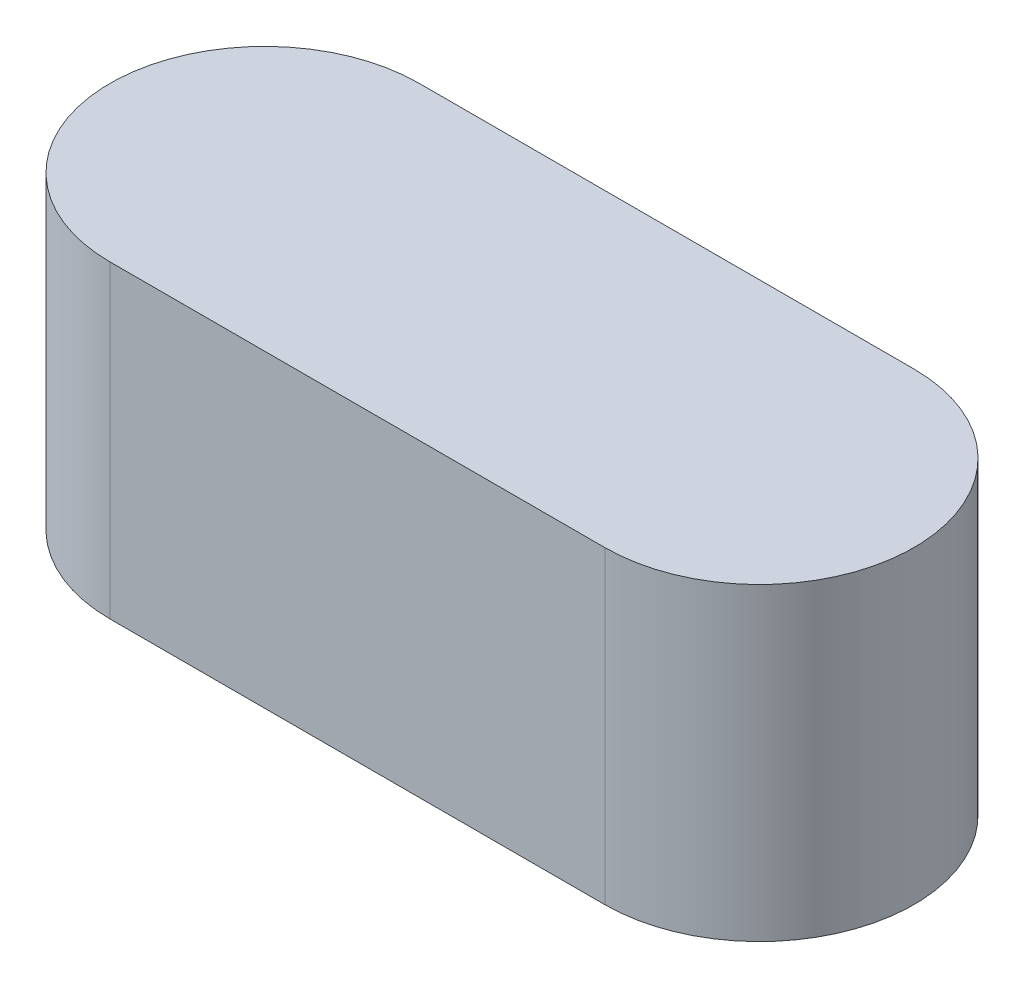
ISO-10303-21;
HEADER;
FILE_DESCRIPTION(('STEP AP214'),'2;1');
FILE_NAME('part.step','',(''),(''),'','','');
FILE_SCHEMA(('AUTOMOTIVE_DESIGN { 1 0 10303 214 1 1 1 1 }'));
ENDSEC;
DATA;
#1=APPLICATION_CONTEXT('core data for automotive mechanical design processes');
#2=APPLICATION_PROTOCOL_DEFINITION('international standard','automotive_design',2000,#1);
#3=PRODUCT_CONTEXT('',#1,'mechanical');
#4=PRODUCT('Part','Part','',(#3));
#5=PRODUCT_RELATED_PRODUCT_CATEGORY('part','',(#4));
#6=PRODUCT_DEFINITION_FORMATION('','',#4);
#7=PRODUCT_DEFINITION_CONTEXT('part definition',#1,'design');
#8=PRODUCT_DEFINITION('design','',#6,#7);
#9=PRODUCT_DEFINITION_SHAPE('','',#8);
#10=(LENGTH_UNIT() NAMED_UNIT(*) SI_UNIT(.MILLI.,.METRE.));
#11=(NAMED_UNIT(*) PLANE_ANGLE_UNIT() SI_UNIT($,.RADIAN.));
#12=(NAMED_UNIT(*) SI_UNIT($,.STERADIAN.) SOLID_ANGLE_UNIT());
#13=UNCERTAINTY_MEASURE_WITH_UNIT(LENGTH_MEASURE(1.E-05),#10,'distance_accuracy_value','');
#14=(GEOMETRIC_REPRESENTATION_CONTEXT(3) GLOBAL_UNCERTAINTY_ASSIGNED_CONTEXT((#13)) GLOBAL_UNIT_ASSIGNED_CONTEXT((#10,
#11,#12)) REPRESENTATION_CONTEXT('',''));
#15=CARTESIAN_POINT('',(0.,0.,0.));
#16=DIRECTION('',(0.,0.,1.));
#17=DIRECTION('',(1.,0.,0.));
#18=AXIS2_PLACEMENT_3D('',#15,#16,#17);
#19=CARTESIAN_POINT('',(0.,5.,0.));
#20=DIRECTION('',(0.,-1.,0.));
#21=DIRECTION('',(0.,0.,-1.));
#22=AXIS2_PLACEMENT_3D('',#19,#20,#21);
#23=CYLINDRICAL_SURFACE('',#22,2.5);
#24=CARTESIAN_POINT('',(0.,0.,0.));
#25=DIRECTION('',(0.,1.,0.));
#26=DIRECTION('',(0.,0.,1.));
#27=AXIS2_PLACEMENT_3D('',#24,#25,#26);
#28=CIRCLE('',#27,2.5);
#29=CARTESIAN_POINT('',(0.,0.,-2.5));
#30=VERTEX_POINT('',#29);
#31=CARTESIAN_POINT('',(0.,0.,2.5));
#32=VERTEX_POINT('',#31);
#33=EDGE_CURVE('E102',#30,#32,#28,.T.);
#34=ORIENTED_EDGE('',*,*,#33,.T.);
#35=DIRECTION('',(0.,-1.,0.));
#36=VECTOR('',#35,1.);
#37=CARTESIAN_POINT('',(0.,5.,2.5));
#38=LINE('',#37,#36);
#39=CARTESIAN_POINT('',(0.,5.,2.5));
#40=VERTEX_POINT('',#39);
#41=EDGE_CURVE('E11',#40,#32,#38,.T.);
#42=ORIENTED_EDGE('',*,*,#41,.F.);
#43=CARTESIAN_POINT('',(0.,5.,0.));
#44=DIRECTION('',(0.,1.,0.));
#45=DIRECTION('',(0.,0.,1.));
#46=AXIS2_PLACEMENT_3D('',#43,#44,#45);
#47=CIRCLE('',#46,2.5);
#48=CARTESIAN_POINT('',(0.,5.,-2.5));
#49=VERTEX_POINT('',#48);
#50=EDGE_CURVE('E90',#49,#40,#47,.T.);
#51=ORIENTED_EDGE('',*,*,#50,.F.);
#52=DIRECTION('',(0.,-1.,0.));
#53=VECTOR('',#52,1.);
#54=CARTESIAN_POINT('',(0.,5.,-2.5));
#55=LINE('',#54,#53);
#56=EDGE_CURVE('E98',#49,#30,#55,.T.);
#57=ORIENTED_EDGE('',*,*,#56,.T.);
#58=EDGE_LOOP('',(#34,#42,#51,#57));
#59=FACE_BOUND('',#58,.T.);
#60=ADVANCED_FACE('F39',(#59),#23,.T.);
#61=CARTESIAN_POINT('',(0.,5.,2.5));
#62=DIRECTION('',(0.,0.,-1.));
#63=DIRECTION('',(-1.,0.,0.));
#64=AXIS2_PLACEMENT_3D('',#61,#62,#63);
#65=PLANE('',#64);
#66=DIRECTION('',(1.,0.,0.));
#67=VECTOR('',#66,1.);
#68=CARTESIAN_POINT('',(0.,0.,2.5));
#69=LINE('',#68,#67);
#70=CARTESIAN_POINT('',(8.,0.,2.5));
#71=VERTEX_POINT('',#70);
#72=EDGE_CURVE('E94',#32,#71,#69,.T.);
#73=ORIENTED_EDGE('',*,*,#72,.T.);
#74=DIRECTION('',(0.,-1.,0.));
#75=VECTOR('',#74,1.);
#76=CARTESIAN_POINT('',(8.,5.,2.5));
#77=LINE('',#76,#75);
#78=CARTESIAN_POINT('',(8.,5.,2.5));
#79=VERTEX_POINT('',#78);
#80=EDGE_CURVE('E47',#79,#71,#77,.T.);
#81=ORIENTED_EDGE('',*,*,#80,.F.);
#82=DIRECTION('',(1.,0.,0.));
#83=VECTOR('',#82,1.);
#84=CARTESIAN_POINT('',(0.,5.,2.5));
#85=LINE('',#84,#83);
#86=EDGE_CURVE('E85',#40,#79,#85,.T.);
#87=ORIENTED_EDGE('',*,*,#86,.F.);
#88=ORIENTED_EDGE('',*,*,#41,.T.);
#89=EDGE_LOOP('',(#73,#81,#87,#88));
#90=FACE_BOUND('',#89,.T.);
#91=ADVANCED_FACE('F93',(#90),#65,.F.);
#92=CARTESIAN_POINT('',(8.,5.,0.));
#93=DIRECTION('',(0.,-1.,0.));
#94=DIRECTION('',(0.,0.,-1.));
#95=AXIS2_PLACEMENT_3D('',#92,#93,#94);
#96=CYLINDRICAL_SURFACE('',#95,2.5);
#97=CARTESIAN_POINT('',(8.,0.,0.));
#98=DIRECTION('',(0.,1.,0.));
#99=DIRECTION('',(0.,0.,1.));
#100=AXIS2_PLACEMENT_3D('',#97,#98,#99);
#101=CIRCLE('',#100,2.5);
#102=CARTESIAN_POINT('',(8.,0.,-2.5));
#103=VERTEX_POINT('',#102);
#104=EDGE_CURVE('E72',#71,#103,#101,.T.);
#105=ORIENTED_EDGE('',*,*,#104,.T.);
#106=DIRECTION('',(0.,-1.,0.));
#107=VECTOR('',#106,1.);
#108=CARTESIAN_POINT('',(8.,5.,-2.5));
#109=LINE('',#108,#107);
#110=CARTESIAN_POINT('',(8.,5.,-2.5));
#111=VERTEX_POINT('',#110);
#112=EDGE_CURVE('E95',#111,#103,#109,.T.);
#113=ORIENTED_EDGE('',*,*,#112,.F.);
#114=CARTESIAN_POINT('',(8.,5.,0.));
#115=DIRECTION('',(0.,1.,0.));
#116=DIRECTION('',(0.,0.,1.));
#117=AXIS2_PLACEMENT_3D('',#114,#115,#116);
#118=CIRCLE('',#117,2.5);
#119=EDGE_CURVE('E88',#79,#111,#118,.T.);
#120=ORIENTED_EDGE('',*,*,#119,.F.);
#121=ORIENTED_EDGE('',*,*,#80,.T.);
#122=EDGE_LOOP('',(#105,#113,#120,#121));
#123=FACE_BOUND('',#122,.T.);
#124=ADVANCED_FACE('F96',(#123),#96,.T.);
#125=CARTESIAN_POINT('',(0.,5.,-2.5));
#126=DIRECTION('',(0.,0.,1.));
#127=DIRECTION('',(1.,0.,0.));
#128=AXIS2_PLACEMENT_3D('',#125,#126,#127);
#129=PLANE('',#128);
#130=DIRECTION('',(-1.,0.,0.));
#131=VECTOR('',#130,1.);
#132=CARTESIAN_POINT('',(0.,0.,-2.5));
#133=LINE('',#132,#131);
#134=EDGE_CURVE('E78',#103,#30,#133,.T.);
#135=ORIENTED_EDGE('',*,*,#134,.T.);
#136=ORIENTED_EDGE('',*,*,#56,.F.);
#137=DIRECTION('',(-1.,0.,0.));
#138=VECTOR('',#137,1.);
#139=CARTESIAN_POINT('',(0.,5.,-2.5));
#140=LINE('',#139,#138);
#141=EDGE_CURVE('E55',#111,#49,#140,.T.);
#142=ORIENTED_EDGE('',*,*,#141,.F.);
#143=ORIENTED_EDGE('',*,*,#112,.T.);
#144=EDGE_LOOP('',(#135,#136,#142,#143));
#145=FACE_BOUND('',#144,.T.);
#146=ADVANCED_FACE('F109',(#145),#129,.F.);
#147=CARTESIAN_POINT('',(0.,5.,0.));
#148=DIRECTION('',(0.,1.,0.));
#149=DIRECTION('',(0.,0.,1.));
#150=AXIS2_PLACEMENT_3D('',#147,#148,#149);
#151=PLANE('',#150);
#152=ORIENTED_EDGE('',*,*,#50,.T.);
#153=ORIENTED_EDGE('',*,*,#86,.T.);
#154=ORIENTED_EDGE('',*,*,#119,.T.);
#155=ORIENTED_EDGE('',*,*,#141,.T.);
#156=EDGE_LOOP('',(#152,#153,#154,#155));
#157=FACE_BOUND('',#156,.T.);
#158=ADVANCED_FACE('F86',(#157),#151,.T.);
#159=CARTESIAN_POINT('',(0.,0.,0.));
#160=DIRECTION('',(0.,1.,0.));
#161=DIRECTION('',(0.,0.,1.));
#162=AXIS2_PLACEMENT_3D('',#159,#160,#161);
#163=PLANE('',#162);
#164=ORIENTED_EDGE('',*,*,#33,.F.);
#165=ORIENTED_EDGE('',*,*,#134,.F.);
#166=ORIENTED_EDGE('',*,*,#104,.F.);
#167=ORIENTED_EDGE('',*,*,#72,.F.);
#168=EDGE_LOOP('',(#164,#165,#166,#167));
#169=FACE_BOUND('',#168,.T.);
#170=ADVANCED_FACE('F112',(#169),#163,.F.);
#171=CLOSED_SHELL('',(#60,#91,#124,#146,#158,#170));
#172=MANIFOLD_SOLID_BREP('B2',#171);
#173=ADVANCED_BREP_SHAPE_REPRESENTATION('',(#18,#172),#14);
#174=SHAPE_DEFINITION_REPRESENTATION(#9,#173);
ENDSEC;
END-ISO-10303-21;
